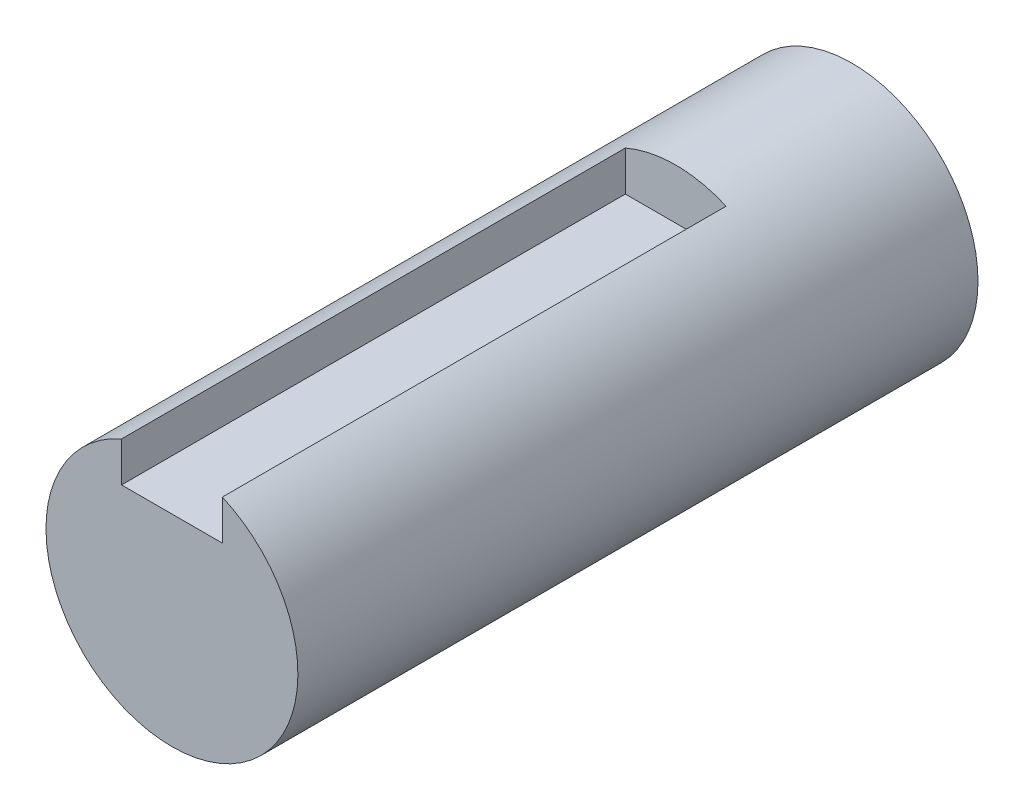
ISO-10303-21;
HEADER;
FILE_DESCRIPTION(('STEP AP214'),'2;1');
FILE_NAME('part.step','',(''),(''),'','','');
FILE_SCHEMA(('AUTOMOTIVE_DESIGN { 1 0 10303 214 1 1 1 1 }'));
ENDSEC;
DATA;
#1=APPLICATION_CONTEXT('core data for automotive mechanical design processes');
#2=APPLICATION_PROTOCOL_DEFINITION('international standard','automotive_design',2000,#1);
#3=PRODUCT_CONTEXT('',#1,'mechanical');
#4=PRODUCT('Part','Part','',(#3));
#5=PRODUCT_RELATED_PRODUCT_CATEGORY('part','',(#4));
#6=PRODUCT_DEFINITION_FORMATION('','',#4);
#7=PRODUCT_DEFINITION_CONTEXT('part definition',#1,'design');
#8=PRODUCT_DEFINITION('design','',#6,#7);
#9=PRODUCT_DEFINITION_SHAPE('','',#8);
#10=(LENGTH_UNIT() NAMED_UNIT(*) SI_UNIT(.MILLI.,.METRE.));
#11=(NAMED_UNIT(*) PLANE_ANGLE_UNIT() SI_UNIT($,.RADIAN.));
#12=(NAMED_UNIT(*) SI_UNIT($,.STERADIAN.) SOLID_ANGLE_UNIT());
#13=UNCERTAINTY_MEASURE_WITH_UNIT(LENGTH_MEASURE(1.E-05),#10,'distance_accuracy_value','');
#14=(GEOMETRIC_REPRESENTATION_CONTEXT(3) GLOBAL_UNCERTAINTY_ASSIGNED_CONTEXT((#13)) GLOBAL_UNIT_ASSIGNED_CONTEXT((#10,
#11,#12)) REPRESENTATION_CONTEXT('',''));
#15=CARTESIAN_POINT('',(0.,0.,0.));
#16=DIRECTION('',(0.,0.,1.));
#17=DIRECTION('',(1.,0.,0.));
#18=AXIS2_PLACEMENT_3D('',#15,#16,#17);
#19=CARTESIAN_POINT('',(0.,0.,27.));
#20=DIRECTION('',(0.,0.,-1.));
#21=DIRECTION('',(-1.,0.,0.));
#22=AXIS2_PLACEMENT_3D('',#19,#20,#21);
#23=CYLINDRICAL_SURFACE('',#22,5.);
#24=CARTESIAN_POINT('',(0.,0.,27.));
#25=DIRECTION('',(0.,0.,1.));
#26=DIRECTION('',(1.,0.,0.));
#27=AXIS2_PLACEMENT_3D('',#24,#25,#26);
#28=CIRCLE('',#27,5.);
#29=CARTESIAN_POINT('',(-2.,4.58257569495584,27.));
#30=VERTEX_POINT('',#29);
#31=CARTESIAN_POINT('',(2.,4.58257569495584,27.));
#32=VERTEX_POINT('',#31);
#33=EDGE_CURVE('E98',#30,#32,#28,.T.);
#34=ORIENTED_EDGE('',*,*,#33,.F.);
#35=DIRECTION('',(0.,0.,-1.));
#36=VECTOR('',#35,1.);
#37=CARTESIAN_POINT('',(-2.,4.58257569495584,27.));
#38=LINE('',#37,#36);
#39=CARTESIAN_POINT('',(-2.,4.58257569495584,7.));
#40=VERTEX_POINT('',#39);
#41=EDGE_CURVE('E94',#30,#40,#38,.T.);
#42=ORIENTED_EDGE('',*,*,#41,.T.);
#43=CARTESIAN_POINT('',(0.,0.,7.));
#44=DIRECTION('',(0.,0.,-1.));
#45=DIRECTION('',(-1.,0.,0.));
#46=AXIS2_PLACEMENT_3D('',#43,#44,#45);
#47=CIRCLE('',#46,5.);
#48=CARTESIAN_POINT('',(2.,4.58257569495584,7.));
#49=VERTEX_POINT('',#48);
#50=EDGE_CURVE('E11',#40,#49,#47,.T.);
#51=ORIENTED_EDGE('',*,*,#50,.T.);
#52=DIRECTION('',(0.,0.,-1.));
#53=VECTOR('',#52,1.);
#54=CARTESIAN_POINT('',(2.,4.58257569495584,27.));
#55=LINE('',#54,#53);
#56=EDGE_CURVE('E77',#32,#49,#55,.T.);
#57=ORIENTED_EDGE('',*,*,#56,.F.);
#58=EDGE_LOOP('',(#34,#42,#51,#57));
#59=FACE_BOUND('',#58,.T.);
#60=CARTESIAN_POINT('',(0.,0.,0.));
#61=DIRECTION('',(0.,0.,1.));
#62=DIRECTION('',(1.,0.,0.));
#63=AXIS2_PLACEMENT_3D('',#60,#61,#62);
#64=CIRCLE('',#63,5.);
#65=CARTESIAN_POINT('',(5.,0.,0.));
#66=VERTEX_POINT('',#65);
#67=EDGE_CURVE('E97',#66,#66,#64,.T.);
#68=ORIENTED_EDGE('',*,*,#67,.T.);
#69=EDGE_LOOP('',(#68));
#70=FACE_BOUND('',#69,.T.);
#71=ADVANCED_FACE('F33',(#59,#70),#23,.T.);
#72=CARTESIAN_POINT('',(0.,0.,27.));
#73=DIRECTION('',(0.,0.,1.));
#74=DIRECTION('',(1.,0.,0.));
#75=AXIS2_PLACEMENT_3D('',#72,#73,#74);
#76=PLANE('',#75);
#77=DIRECTION('',(0.,-1.,0.));
#78=VECTOR('',#77,1.);
#79=CARTESIAN_POINT('',(-2.,0.,27.));
#80=LINE('',#79,#78);
#81=CARTESIAN_POINT('',(-2.,3.,27.));
#82=VERTEX_POINT('',#81);
#83=EDGE_CURVE('E40',#30,#82,#80,.T.);
#84=ORIENTED_EDGE('',*,*,#83,.F.);
#85=ORIENTED_EDGE('',*,*,#33,.T.);
#86=DIRECTION('',(0.,-1.,0.));
#87=VECTOR('',#86,1.);
#88=CARTESIAN_POINT('',(2.,0.,27.));
#89=LINE('',#88,#87);
#90=CARTESIAN_POINT('',(2.,3.,27.));
#91=VERTEX_POINT('',#90);
#92=EDGE_CURVE('E101',#32,#91,#89,.T.);
#93=ORIENTED_EDGE('',*,*,#92,.T.);
#94=DIRECTION('',(1.,0.,0.));
#95=VECTOR('',#94,1.);
#96=CARTESIAN_POINT('',(-2.,3.,27.));
#97=LINE('',#96,#95);
#98=EDGE_CURVE('E47',#82,#91,#97,.T.);
#99=ORIENTED_EDGE('',*,*,#98,.F.);
#100=EDGE_LOOP('',(#84,#85,#93,#99));
#101=FACE_BOUND('',#100,.T.);
#102=ADVANCED_FACE('F109',(#101),#76,.T.);
#103=CARTESIAN_POINT('',(0.,0.,0.));
#104=DIRECTION('',(0.,0.,1.));
#105=DIRECTION('',(1.,0.,0.));
#106=AXIS2_PLACEMENT_3D('',#103,#104,#105);
#107=PLANE('',#106);
#108=ORIENTED_EDGE('',*,*,#67,.F.);
#109=EDGE_LOOP('',(#108));
#110=FACE_BOUND('',#109,.T.);
#111=ADVANCED_FACE('F115',(#110),#107,.F.);
#112=CARTESIAN_POINT('',(0.,0.,7.));
#113=DIRECTION('',(0.,0.,-1.));
#114=DIRECTION('',(-1.,0.,0.));
#115=AXIS2_PLACEMENT_3D('',#112,#113,#114);
#116=PLANE('',#115);
#117=DIRECTION('',(0.,-1.,0.));
#118=VECTOR('',#117,1.);
#119=CARTESIAN_POINT('',(-2.,7.,7.));
#120=LINE('',#119,#118);
#121=CARTESIAN_POINT('',(-2.,3.,7.));
#122=VERTEX_POINT('',#121);
#123=EDGE_CURVE('E79',#40,#122,#120,.T.);
#124=ORIENTED_EDGE('',*,*,#123,.T.);
#125=DIRECTION('',(1.,0.,0.));
#126=VECTOR('',#125,1.);
#127=CARTESIAN_POINT('',(-2.,3.,7.));
#128=LINE('',#127,#126);
#129=CARTESIAN_POINT('',(2.,3.,7.));
#130=VERTEX_POINT('',#129);
#131=EDGE_CURVE('E80',#122,#130,#128,.T.);
#132=ORIENTED_EDGE('',*,*,#131,.T.);
#133=DIRECTION('',(0.,-1.,0.));
#134=VECTOR('',#133,1.);
#135=CARTESIAN_POINT('',(2.,7.,7.));
#136=LINE('',#135,#134);
#137=EDGE_CURVE('E72',#49,#130,#136,.T.);
#138=ORIENTED_EDGE('',*,*,#137,.F.);
#139=ORIENTED_EDGE('',*,*,#50,.F.);
#140=EDGE_LOOP('',(#124,#132,#138,#139));
#141=FACE_BOUND('',#140,.T.);
#142=ADVANCED_FACE('F86',(#141),#116,.F.);
#143=CARTESIAN_POINT('',(-2.,7.,7.));
#144=DIRECTION('',(-1.,0.,0.));
#145=DIRECTION('',(0.,0.,1.));
#146=AXIS2_PLACEMENT_3D('',#143,#144,#145);
#147=PLANE('',#146);
#148=ORIENTED_EDGE('',*,*,#83,.T.);
#149=DIRECTION('',(0.,0.,1.));
#150=VECTOR('',#149,1.);
#151=CARTESIAN_POINT('',(-2.,3.,7.));
#152=LINE('',#151,#150);
#153=EDGE_CURVE('E84',#122,#82,#152,.T.);
#154=ORIENTED_EDGE('',*,*,#153,.F.);
#155=ORIENTED_EDGE('',*,*,#123,.F.);
#156=ORIENTED_EDGE('',*,*,#41,.F.);
#157=EDGE_LOOP('',(#148,#154,#155,#156));
#158=FACE_BOUND('',#157,.T.);
#159=ADVANCED_FACE('F106',(#158),#147,.F.);
#160=CARTESIAN_POINT('',(2.,7.,7.));
#161=DIRECTION('',(-1.,0.,0.));
#162=DIRECTION('',(0.,0.,1.));
#163=AXIS2_PLACEMENT_3D('',#160,#161,#162);
#164=PLANE('',#163);
#165=ORIENTED_EDGE('',*,*,#56,.T.);
#166=ORIENTED_EDGE('',*,*,#137,.T.);
#167=DIRECTION('',(0.,0.,1.));
#168=VECTOR('',#167,1.);
#169=CARTESIAN_POINT('',(2.,3.,7.));
#170=LINE('',#169,#168);
#171=EDGE_CURVE('E74',#130,#91,#170,.T.);
#172=ORIENTED_EDGE('',*,*,#171,.T.);
#173=ORIENTED_EDGE('',*,*,#92,.F.);
#174=EDGE_LOOP('',(#165,#166,#172,#173));
#175=FACE_BOUND('',#174,.T.);
#176=ADVANCED_FACE('F73',(#175),#164,.T.);
#177=CARTESIAN_POINT('',(-2.,3.,7.));
#178=DIRECTION('',(0.,-1.,0.));
#179=DIRECTION('',(1.,0.,0.));
#180=AXIS2_PLACEMENT_3D('',#177,#178,#179);
#181=PLANE('',#180);
#182=ORIENTED_EDGE('',*,*,#98,.T.);
#183=ORIENTED_EDGE('',*,*,#171,.F.);
#184=ORIENTED_EDGE('',*,*,#131,.F.);
#185=ORIENTED_EDGE('',*,*,#153,.T.);
#186=EDGE_LOOP('',(#182,#183,#184,#185));
#187=FACE_BOUND('',#186,.T.);
#188=ADVANCED_FACE('F83',(#187),#181,.F.);
#189=CLOSED_SHELL('',(#71,#102,#111,#142,#159,#176,#188));
#190=MANIFOLD_SOLID_BREP('B2',#189);
#191=ADVANCED_BREP_SHAPE_REPRESENTATION('',(#18,#190),#14);
#192=SHAPE_DEFINITION_REPRESENTATION(#9,#191);
ENDSEC;
END-ISO-10303-21;
